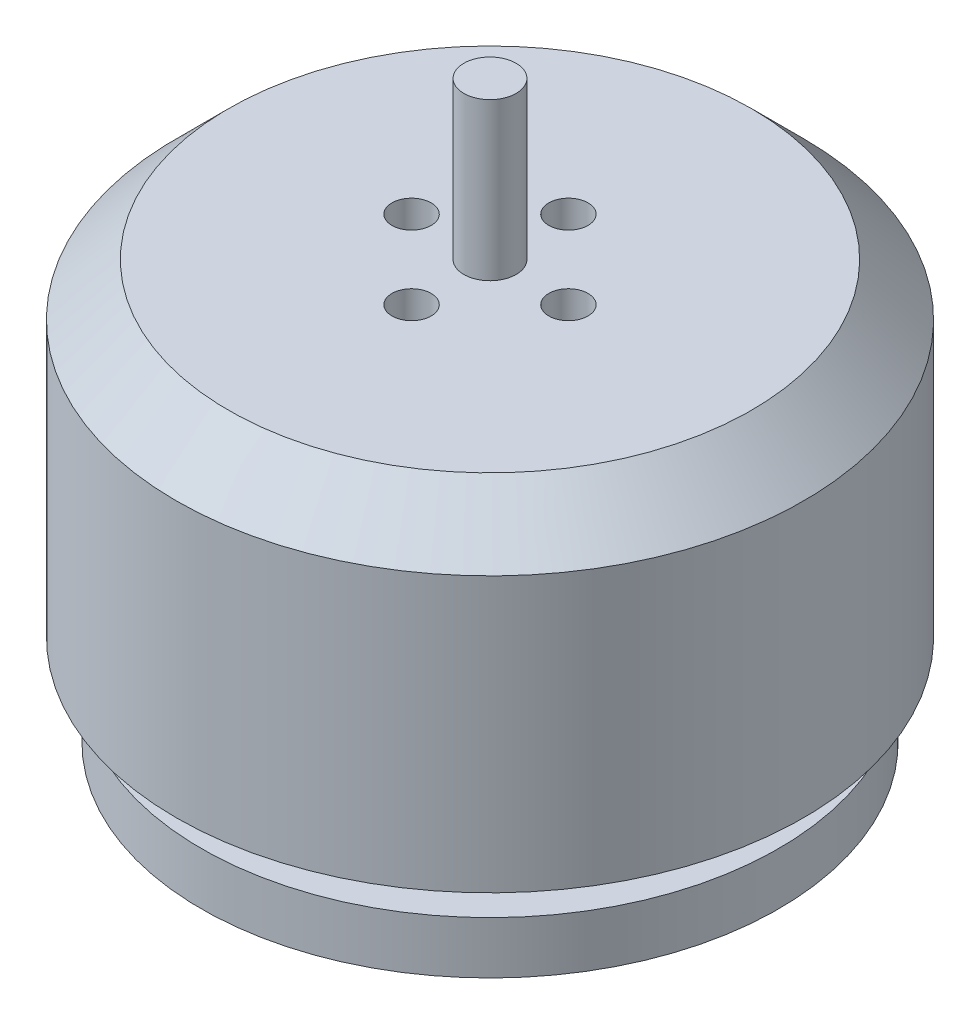
ISO-10303-21;
HEADER;
FILE_DESCRIPTION(('STEP AP214'),'2;1');
FILE_NAME('part.step','',(''),(''),'','','');
FILE_SCHEMA(('AUTOMOTIVE_DESIGN { 1 0 10303 214 1 1 1 1 }'));
ENDSEC;
DATA;
#1=APPLICATION_CONTEXT('core data for automotive mechanical design processes');
#2=APPLICATION_PROTOCOL_DEFINITION('international standard','automotive_design',2000,#1);
#3=PRODUCT_CONTEXT('',#1,'mechanical');
#4=PRODUCT('Part','Part','',(#3));
#5=PRODUCT_RELATED_PRODUCT_CATEGORY('part','',(#4));
#6=PRODUCT_DEFINITION_FORMATION('','',#4);
#7=PRODUCT_DEFINITION_CONTEXT('part definition',#1,'design');
#8=PRODUCT_DEFINITION('design','',#6,#7);
#9=PRODUCT_DEFINITION_SHAPE('','',#8);
#10=(LENGTH_UNIT() NAMED_UNIT(*) SI_UNIT(.MILLI.,.METRE.));
#11=(NAMED_UNIT(*) PLANE_ANGLE_UNIT() SI_UNIT($,.RADIAN.));
#12=(NAMED_UNIT(*) SI_UNIT($,.STERADIAN.) SOLID_ANGLE_UNIT());
#13=UNCERTAINTY_MEASURE_WITH_UNIT(LENGTH_MEASURE(1.E-05),#10,'distance_accuracy_value','');
#14=(GEOMETRIC_REPRESENTATION_CONTEXT(3) GLOBAL_UNCERTAINTY_ASSIGNED_CONTEXT((#13)) GLOBAL_UNIT_ASSIGNED_CONTEXT((#10,
#11,#12)) REPRESENTATION_CONTEXT('',''));
#15=CARTESIAN_POINT('',(0.,0.,0.));
#16=DIRECTION('',(0.,0.,1.));
#17=DIRECTION('',(1.,0.,0.));
#18=AXIS2_PLACEMENT_3D('',#15,#16,#17);
#19=CARTESIAN_POINT('',(0.,0.,0.));
#20=DIRECTION('',(0.,-1.,0.));
#21=DIRECTION('',(0.,0.,-1.));
#22=AXIS2_PLACEMENT_3D('',#19,#20,#21);
#23=PLANE('',#22);
#24=CARTESIAN_POINT('',(8.84,0.,-8.84));
#25=DIRECTION('',(0.,1.,0.));
#26=DIRECTION('',(0.,0.,1.));
#27=AXIS2_PLACEMENT_3D('',#24,#25,#26);
#28=CIRCLE('',#27,1.5);
#29=CARTESIAN_POINT('',(8.84,0.,-7.34));
#30=VERTEX_POINT('',#29);
#31=EDGE_CURVE('E75',#30,#30,#28,.T.);
#32=ORIENTED_EDGE('',*,*,#31,.T.);
#33=EDGE_LOOP('',(#32));
#34=FACE_BOUND('',#33,.T.);
#35=CARTESIAN_POINT('',(-8.84,0.,8.84));
#36=DIRECTION('',(0.,1.,0.));
#37=DIRECTION('',(0.,0.,1.));
#38=AXIS2_PLACEMENT_3D('',#35,#36,#37);
#39=CIRCLE('',#38,1.5);
#40=CARTESIAN_POINT('',(-8.84,0.,10.34));
#41=VERTEX_POINT('',#40);
#42=EDGE_CURVE('E81',#41,#41,#39,.T.);
#43=ORIENTED_EDGE('',*,*,#42,.T.);
#44=EDGE_LOOP('',(#43));
#45=FACE_BOUND('',#44,.T.);
#46=CARTESIAN_POINT('',(-8.84,0.,-8.84));
#47=DIRECTION('',(0.,1.,0.));
#48=DIRECTION('',(0.,0.,1.));
#49=AXIS2_PLACEMENT_3D('',#46,#47,#48);
#50=CIRCLE('',#49,1.5);
#51=CARTESIAN_POINT('',(-8.84,0.,-7.34));
#52=VERTEX_POINT('',#51);
#53=EDGE_CURVE('E82',#52,#52,#50,.T.);
#54=ORIENTED_EDGE('',*,*,#53,.T.);
#55=EDGE_LOOP('',(#54));
#56=FACE_BOUND('',#55,.T.);
#57=CARTESIAN_POINT('',(8.84,0.,8.84));
#58=DIRECTION('',(0.,1.,0.));
#59=DIRECTION('',(0.,0.,1.));
#60=AXIS2_PLACEMENT_3D('',#57,#58,#59);
#61=CIRCLE('',#60,1.5);
#62=CARTESIAN_POINT('',(8.84,0.,10.34));
#63=VERTEX_POINT('',#62);
#64=EDGE_CURVE('E72',#63,#63,#61,.T.);
#65=ORIENTED_EDGE('',*,*,#64,.T.);
#66=EDGE_LOOP('',(#65));
#67=FACE_BOUND('',#66,.T.);
#68=CARTESIAN_POINT('',(0.,0.,0.));
#69=DIRECTION('',(0.,-1.,0.));
#70=DIRECTION('',(0.,0.,-1.));
#71=AXIS2_PLACEMENT_3D('',#68,#69,#70);
#72=CIRCLE('',#71,22.08);
#73=CARTESIAN_POINT('',(0.,0.,-22.08));
#74=VERTEX_POINT('',#73);
#75=EDGE_CURVE('E10',#74,#74,#72,.T.);
#76=ORIENTED_EDGE('',*,*,#75,.T.);
#77=EDGE_LOOP('',(#76));
#78=FACE_BOUND('',#77,.T.);
#79=ADVANCED_FACE('F37',(#34,#45,#56,#67,#78),#23,.T.);
#80=CARTESIAN_POINT('',(0.,-10.,0.));
#81=DIRECTION('',(0.,-1.,0.));
#82=DIRECTION('',(0.,0.,-1.));
#83=AXIS2_PLACEMENT_3D('',#80,#81,#82);
#84=CYLINDRICAL_SURFACE('',#83,22.08);
#85=CARTESIAN_POINT('',(0.,4.,0.));
#86=DIRECTION('',(0.,-1.,0.));
#87=DIRECTION('',(0.,0.,-1.));
#88=AXIS2_PLACEMENT_3D('',#85,#86,#87);
#89=CIRCLE('',#88,22.08);
#90=CARTESIAN_POINT('',(0.,4.,-22.08));
#91=VERTEX_POINT('',#90);
#92=EDGE_CURVE('E43',#91,#91,#89,.T.);
#93=ORIENTED_EDGE('',*,*,#92,.T.);
#94=EDGE_LOOP('',(#93));
#95=FACE_BOUND('',#94,.T.);
#96=ORIENTED_EDGE('',*,*,#75,.F.);
#97=EDGE_LOOP('',(#96));
#98=FACE_BOUND('',#97,.T.);
#99=ADVANCED_FACE('F171',(#95,#98),#84,.T.);
#100=CARTESIAN_POINT('',(22.08,4.,0.));
#101=DIRECTION('',(0.,1.,0.));
#102=DIRECTION('',(0.,0.,1.));
#103=AXIS2_PLACEMENT_3D('',#100,#101,#102);
#104=PLANE('',#103);
#105=CARTESIAN_POINT('',(0.,4.,0.));
#106=DIRECTION('',(0.,-1.,0.));
#107=DIRECTION('',(0.,0.,-1.));
#108=AXIS2_PLACEMENT_3D('',#105,#106,#107);
#109=CIRCLE('',#108,16.8);
#110=CARTESIAN_POINT('',(0.,4.,-16.8));
#111=VERTEX_POINT('',#110);
#112=EDGE_CURVE('E47',#111,#111,#109,.T.);
#113=ORIENTED_EDGE('',*,*,#112,.T.);
#114=EDGE_LOOP('',(#113));
#115=FACE_BOUND('',#114,.T.);
#116=ORIENTED_EDGE('',*,*,#92,.F.);
#117=EDGE_LOOP('',(#116));
#118=FACE_BOUND('',#117,.T.);
#119=ADVANCED_FACE('F165',(#115,#118),#104,.T.);
#120=CARTESIAN_POINT('',(0.,-10.,0.));
#121=DIRECTION('',(0.,-1.,0.));
#122=DIRECTION('',(0.,0.,-1.));
#123=AXIS2_PLACEMENT_3D('',#120,#121,#122);
#124=CYLINDRICAL_SURFACE('',#123,16.8);
#125=CARTESIAN_POINT('',(0.,7.,0.));
#126=DIRECTION('',(0.,-1.,0.));
#127=DIRECTION('',(0.,0.,-1.));
#128=AXIS2_PLACEMENT_3D('',#125,#126,#127);
#129=CIRCLE('',#128,16.8);
#130=CARTESIAN_POINT('',(0.,7.,-16.8));
#131=VERTEX_POINT('',#130);
#132=EDGE_CURVE('E51',#131,#131,#129,.T.);
#133=ORIENTED_EDGE('',*,*,#132,.T.);
#134=EDGE_LOOP('',(#133));
#135=FACE_BOUND('',#134,.T.);
#136=ORIENTED_EDGE('',*,*,#112,.F.);
#137=EDGE_LOOP('',(#136));
#138=FACE_BOUND('',#137,.T.);
#139=ADVANCED_FACE('F159',(#135,#138),#124,.T.);
#140=CARTESIAN_POINT('',(16.8,7.,0.));
#141=DIRECTION('',(0.,-1.,0.));
#142=DIRECTION('',(0.,0.,-1.));
#143=AXIS2_PLACEMENT_3D('',#140,#141,#142);
#144=PLANE('',#143);
#145=CARTESIAN_POINT('',(0.,7.,0.));
#146=DIRECTION('',(0.,-1.,0.));
#147=DIRECTION('',(0.,0.,-1.));
#148=AXIS2_PLACEMENT_3D('',#145,#146,#147);
#149=CIRCLE('',#148,24.);
#150=CARTESIAN_POINT('',(0.,7.,-24.));
#151=VERTEX_POINT('',#150);
#152=EDGE_CURVE('E56',#151,#151,#149,.T.);
#153=ORIENTED_EDGE('',*,*,#152,.T.);
#154=EDGE_LOOP('',(#153));
#155=FACE_BOUND('',#154,.T.);
#156=ORIENTED_EDGE('',*,*,#132,.F.);
#157=EDGE_LOOP('',(#156));
#158=FACE_BOUND('',#157,.T.);
#159=ADVANCED_FACE('F153',(#155,#158),#144,.T.);
#160=CARTESIAN_POINT('',(0.,-10.,0.));
#161=DIRECTION('',(0.,-1.,0.));
#162=DIRECTION('',(0.,0.,-1.));
#163=AXIS2_PLACEMENT_3D('',#160,#161,#162);
#164=CYLINDRICAL_SURFACE('',#163,24.);
#165=CARTESIAN_POINT('',(0.,28.,0.));
#166=DIRECTION('',(0.,-1.,0.));
#167=DIRECTION('',(0.,0.,-1.));
#168=AXIS2_PLACEMENT_3D('',#165,#166,#167);
#169=CIRCLE('',#168,24.);
#170=CARTESIAN_POINT('',(0.,28.,-24.));
#171=VERTEX_POINT('',#170);
#172=EDGE_CURVE('E59',#171,#171,#169,.T.);
#173=ORIENTED_EDGE('',*,*,#172,.T.);
#174=EDGE_LOOP('',(#173));
#175=FACE_BOUND('',#174,.T.);
#176=ORIENTED_EDGE('',*,*,#152,.F.);
#177=EDGE_LOOP('',(#176));
#178=FACE_BOUND('',#177,.T.);
#179=ADVANCED_FACE('F147',(#175,#178),#164,.T.);
#180=CARTESIAN_POINT('',(0.,28.,0.));
#181=DIRECTION('',(0.,-1.,0.));
#182=DIRECTION('',(0.,0.,-1.));
#183=AXIS2_PLACEMENT_3D('',#180,#181,#182);
#184=CONICAL_SURFACE('',#183,24.,0.785398163397448);
#185=CARTESIAN_POINT('',(0.,32.,0.));
#186=DIRECTION('',(0.,-1.,0.));
#187=DIRECTION('',(0.,0.,-1.));
#188=AXIS2_PLACEMENT_3D('',#185,#186,#187);
#189=CIRCLE('',#188,20.);
#190=CARTESIAN_POINT('',(0.,32.,-20.));
#191=VERTEX_POINT('',#190);
#192=EDGE_CURVE('E62',#191,#191,#189,.T.);
#193=ORIENTED_EDGE('',*,*,#192,.T.);
#194=EDGE_LOOP('',(#193));
#195=FACE_BOUND('',#194,.T.);
#196=ORIENTED_EDGE('',*,*,#172,.F.);
#197=EDGE_LOOP('',(#196));
#198=FACE_BOUND('',#197,.T.);
#199=ADVANCED_FACE('F133',(#195,#198),#184,.T.);
#200=CARTESIAN_POINT('',(20.,32.,0.));
#201=DIRECTION('',(0.,1.,0.));
#202=DIRECTION('',(0.,0.,1.));
#203=AXIS2_PLACEMENT_3D('',#200,#201,#202);
#204=PLANE('',#203);
#205=CARTESIAN_POINT('',(6.,32.,0.));
#206=DIRECTION('',(0.,1.,0.));
#207=DIRECTION('',(0.,0.,1.));
#208=AXIS2_PLACEMENT_3D('',#205,#206,#207);
#209=CIRCLE('',#208,1.5);
#210=CARTESIAN_POINT('',(6.,32.,1.5));
#211=VERTEX_POINT('',#210);
#212=EDGE_CURVE('E114',#211,#211,#209,.T.);
#213=ORIENTED_EDGE('',*,*,#212,.F.);
#214=EDGE_LOOP('',(#213));
#215=FACE_BOUND('',#214,.T.);
#216=CARTESIAN_POINT('',(-6.,32.,0.));
#217=DIRECTION('',(0.,1.,0.));
#218=DIRECTION('',(0.,0.,1.));
#219=AXIS2_PLACEMENT_3D('',#216,#217,#218);
#220=CIRCLE('',#219,1.5);
#221=CARTESIAN_POINT('',(-6.,32.,1.5));
#222=VERTEX_POINT('',#221);
#223=EDGE_CURVE('E111',#222,#222,#220,.T.);
#224=ORIENTED_EDGE('',*,*,#223,.F.);
#225=EDGE_LOOP('',(#224));
#226=FACE_BOUND('',#225,.T.);
#227=CARTESIAN_POINT('',(0.,32.,6.));
#228=DIRECTION('',(0.,1.,0.));
#229=DIRECTION('',(0.,0.,1.));
#230=AXIS2_PLACEMENT_3D('',#227,#228,#229);
#231=CIRCLE('',#230,1.5);
#232=CARTESIAN_POINT('',(0.,32.,7.5));
#233=VERTEX_POINT('',#232);
#234=EDGE_CURVE('E105',#233,#233,#231,.T.);
#235=ORIENTED_EDGE('',*,*,#234,.F.);
#236=EDGE_LOOP('',(#235));
#237=FACE_BOUND('',#236,.T.);
#238=CARTESIAN_POINT('',(0.,32.,-6.));
#239=DIRECTION('',(0.,1.,0.));
#240=DIRECTION('',(0.,0.,1.));
#241=AXIS2_PLACEMENT_3D('',#238,#239,#240);
#242=CIRCLE('',#241,1.5);
#243=CARTESIAN_POINT('',(0.,32.,-4.5));
#244=VERTEX_POINT('',#243);
#245=EDGE_CURVE('E99',#244,#244,#242,.T.);
#246=ORIENTED_EDGE('',*,*,#245,.F.);
#247=EDGE_LOOP('',(#246));
#248=FACE_BOUND('',#247,.T.);
#249=CARTESIAN_POINT('',(0.,32.,0.));
#250=DIRECTION('',(0.,-1.,0.));
#251=DIRECTION('',(0.,0.,-1.));
#252=AXIS2_PLACEMENT_3D('',#249,#250,#251);
#253=CIRCLE('',#252,2.);
#254=CARTESIAN_POINT('',(0.,32.,-2.));
#255=VERTEX_POINT('',#254);
#256=EDGE_CURVE('E65',#255,#255,#253,.T.);
#257=ORIENTED_EDGE('',*,*,#256,.T.);
#258=EDGE_LOOP('',(#257));
#259=FACE_BOUND('',#258,.T.);
#260=ORIENTED_EDGE('',*,*,#192,.F.);
#261=EDGE_LOOP('',(#260));
#262=FACE_BOUND('',#261,.T.);
#263=ADVANCED_FACE('F129',(#215,#226,#237,#248,#259,#262),#204,.T.);
#264=CARTESIAN_POINT('',(0.,-10.,0.));
#265=DIRECTION('',(0.,-1.,0.));
#266=DIRECTION('',(0.,0.,-1.));
#267=AXIS2_PLACEMENT_3D('',#264,#265,#266);
#268=CYLINDRICAL_SURFACE('',#267,2.);
#269=CARTESIAN_POINT('',(0.,44.,0.));
#270=DIRECTION('',(0.,-1.,0.));
#271=DIRECTION('',(0.,0.,-1.));
#272=AXIS2_PLACEMENT_3D('',#269,#270,#271);
#273=CIRCLE('',#272,2.);
#274=CARTESIAN_POINT('',(0.,44.,-2.));
#275=VERTEX_POINT('',#274);
#276=EDGE_CURVE('E68',#275,#275,#273,.T.);
#277=ORIENTED_EDGE('',*,*,#276,.T.);
#278=EDGE_LOOP('',(#277));
#279=FACE_BOUND('',#278,.T.);
#280=ORIENTED_EDGE('',*,*,#256,.F.);
#281=EDGE_LOOP('',(#280));
#282=FACE_BOUND('',#281,.T.);
#283=ADVANCED_FACE('F132',(#279,#282),#268,.T.);
#284=CARTESIAN_POINT('',(2.,44.,0.));
#285=DIRECTION('',(0.,1.,0.));
#286=DIRECTION('',(0.,0.,1.));
#287=AXIS2_PLACEMENT_3D('',#284,#285,#286);
#288=PLANE('',#287);
#289=ORIENTED_EDGE('',*,*,#276,.F.);
#290=EDGE_LOOP('',(#289));
#291=FACE_BOUND('',#290,.T.);
#292=ADVANCED_FACE('F192',(#291),#288,.T.);
#293=CARTESIAN_POINT('',(8.84,3.3,8.84));
#294=DIRECTION('',(0.,-1.,0.));
#295=DIRECTION('',(0.,0.,-1.));
#296=AXIS2_PLACEMENT_3D('',#293,#294,#295);
#297=CYLINDRICAL_SURFACE('',#296,1.5);
#298=CARTESIAN_POINT('',(8.84,3.3,8.84));
#299=DIRECTION('',(0.,1.,0.));
#300=DIRECTION('',(0.,0.,1.));
#301=AXIS2_PLACEMENT_3D('',#298,#299,#300);
#302=CIRCLE('',#301,1.5);
#303=CARTESIAN_POINT('',(8.84,3.3,10.34));
#304=VERTEX_POINT('',#303);
#305=EDGE_CURVE('E71',#304,#304,#302,.T.);
#306=ORIENTED_EDGE('',*,*,#305,.T.);
#307=EDGE_LOOP('',(#306));
#308=FACE_BOUND('',#307,.T.);
#309=ORIENTED_EDGE('',*,*,#64,.F.);
#310=EDGE_LOOP('',(#309));
#311=FACE_BOUND('',#310,.T.);
#312=ADVANCED_FACE('F190',(#308,#311),#297,.F.);
#313=CARTESIAN_POINT('',(8.84,3.3,8.84));
#314=DIRECTION('',(0.,1.,0.));
#315=DIRECTION('',(0.,0.,1.));
#316=AXIS2_PLACEMENT_3D('',#313,#314,#315);
#317=PLANE('',#316);
#318=ORIENTED_EDGE('',*,*,#305,.F.);
#319=EDGE_LOOP('',(#318));
#320=FACE_BOUND('',#319,.T.);
#321=ADVANCED_FACE('F191',(#320),#317,.F.);
#322=CARTESIAN_POINT('',(-8.84,3.3,-8.84));
#323=DIRECTION('',(0.,-1.,0.));
#324=DIRECTION('',(0.,0.,-1.));
#325=AXIS2_PLACEMENT_3D('',#322,#323,#324);
#326=CYLINDRICAL_SURFACE('',#325,1.5);
#327=CARTESIAN_POINT('',(-8.84,3.3,-8.84));
#328=DIRECTION('',(0.,1.,0.));
#329=DIRECTION('',(0.,0.,1.));
#330=AXIS2_PLACEMENT_3D('',#327,#328,#329);
#331=CIRCLE('',#330,1.5);
#332=CARTESIAN_POINT('',(-8.84,3.3,-7.34));
#333=VERTEX_POINT('',#332);
#334=EDGE_CURVE('E90',#333,#333,#331,.T.);
#335=ORIENTED_EDGE('',*,*,#334,.T.);
#336=EDGE_LOOP('',(#335));
#337=FACE_BOUND('',#336,.T.);
#338=ORIENTED_EDGE('',*,*,#53,.F.);
#339=EDGE_LOOP('',(#338));
#340=FACE_BOUND('',#339,.T.);
#341=ADVANCED_FACE('F198',(#337,#340),#326,.F.);
#342=CARTESIAN_POINT('',(-8.84,3.3,-8.84));
#343=DIRECTION('',(0.,1.,0.));
#344=DIRECTION('',(0.,0.,1.));
#345=AXIS2_PLACEMENT_3D('',#342,#343,#344);
#346=PLANE('',#345);
#347=ORIENTED_EDGE('',*,*,#334,.F.);
#348=EDGE_LOOP('',(#347));
#349=FACE_BOUND('',#348,.T.);
#350=ADVANCED_FACE('F239',(#349),#346,.F.);
#351=CARTESIAN_POINT('',(-8.84,3.3,8.84));
#352=DIRECTION('',(0.,-1.,0.));
#353=DIRECTION('',(0.,0.,-1.));
#354=AXIS2_PLACEMENT_3D('',#351,#352,#353);
#355=CYLINDRICAL_SURFACE('',#354,1.5);
#356=CARTESIAN_POINT('',(-8.84,3.3,8.84));
#357=DIRECTION('',(0.,1.,0.));
#358=DIRECTION('',(0.,0.,1.));
#359=AXIS2_PLACEMENT_3D('',#356,#357,#358);
#360=CIRCLE('',#359,1.5);
#361=CARTESIAN_POINT('',(-8.84,3.3,10.34));
#362=VERTEX_POINT('',#361);
#363=EDGE_CURVE('E78',#362,#362,#360,.T.);
#364=ORIENTED_EDGE('',*,*,#363,.T.);
#365=EDGE_LOOP('',(#364));
#366=FACE_BOUND('',#365,.T.);
#367=ORIENTED_EDGE('',*,*,#42,.F.);
#368=EDGE_LOOP('',(#367));
#369=FACE_BOUND('',#368,.T.);
#370=ADVANCED_FACE('F249',(#366,#369),#355,.F.);
#371=CARTESIAN_POINT('',(-8.84,3.3,8.84));
#372=DIRECTION('',(0.,1.,0.));
#373=DIRECTION('',(0.,0.,1.));
#374=AXIS2_PLACEMENT_3D('',#371,#372,#373);
#375=PLANE('',#374);
#376=ORIENTED_EDGE('',*,*,#363,.F.);
#377=EDGE_LOOP('',(#376));
#378=FACE_BOUND('',#377,.T.);
#379=ADVANCED_FACE('F259',(#378),#375,.F.);
#380=CARTESIAN_POINT('',(8.84,3.3,-8.84));
#381=DIRECTION('',(0.,-1.,0.));
#382=DIRECTION('',(0.,0.,-1.));
#383=AXIS2_PLACEMENT_3D('',#380,#381,#382);
#384=CYLINDRICAL_SURFACE('',#383,1.5);
#385=CARTESIAN_POINT('',(8.84,3.3,-8.84));
#386=DIRECTION('',(0.,1.,0.));
#387=DIRECTION('',(0.,0.,1.));
#388=AXIS2_PLACEMENT_3D('',#385,#386,#387);
#389=CIRCLE('',#388,1.5);
#390=CARTESIAN_POINT('',(8.84,3.3,-7.34));
#391=VERTEX_POINT('',#390);
#392=EDGE_CURVE('E85',#391,#391,#389,.T.);
#393=ORIENTED_EDGE('',*,*,#392,.T.);
#394=EDGE_LOOP('',(#393));
#395=FACE_BOUND('',#394,.T.);
#396=ORIENTED_EDGE('',*,*,#31,.F.);
#397=EDGE_LOOP('',(#396));
#398=FACE_BOUND('',#397,.T.);
#399=ADVANCED_FACE('F269',(#395,#398),#384,.F.);
#400=CARTESIAN_POINT('',(8.84,3.3,-8.84));
#401=DIRECTION('',(0.,1.,0.));
#402=DIRECTION('',(0.,0.,1.));
#403=AXIS2_PLACEMENT_3D('',#400,#401,#402);
#404=PLANE('',#403);
#405=ORIENTED_EDGE('',*,*,#392,.F.);
#406=EDGE_LOOP('',(#405));
#407=FACE_BOUND('',#406,.T.);
#408=ADVANCED_FACE('F278',(#407),#404,.F.);
#409=CARTESIAN_POINT('',(0.,24.,-6.));
#410=DIRECTION('',(0.,1.,0.));
#411=DIRECTION('',(0.,0.,1.));
#412=AXIS2_PLACEMENT_3D('',#409,#410,#411);
#413=CYLINDRICAL_SURFACE('',#412,1.5);
#414=CARTESIAN_POINT('',(0.,24.,-6.));
#415=DIRECTION('',(0.,1.,0.));
#416=DIRECTION('',(0.,0.,1.));
#417=AXIS2_PLACEMENT_3D('',#414,#415,#416);
#418=CIRCLE('',#417,1.5);
#419=CARTESIAN_POINT('',(0.,24.,-4.5));
#420=VERTEX_POINT('',#419);
#421=EDGE_CURVE('E96',#420,#420,#418,.T.);
#422=ORIENTED_EDGE('',*,*,#421,.F.);
#423=EDGE_LOOP('',(#422));
#424=FACE_BOUND('',#423,.T.);
#425=ORIENTED_EDGE('',*,*,#245,.T.);
#426=EDGE_LOOP('',(#425));
#427=FACE_BOUND('',#426,.T.);
#428=ADVANCED_FACE('F288',(#424,#427),#413,.F.);
#429=CARTESIAN_POINT('',(0.,24.,-6.));
#430=DIRECTION('',(0.,1.,0.));
#431=DIRECTION('',(0.,0.,1.));
#432=AXIS2_PLACEMENT_3D('',#429,#430,#431);
#433=PLANE('',#432);
#434=ORIENTED_EDGE('',*,*,#421,.T.);
#435=EDGE_LOOP('',(#434));
#436=FACE_BOUND('',#435,.T.);
#437=ADVANCED_FACE('F298',(#436),#433,.T.);
#438=CARTESIAN_POINT('',(0.,24.,6.));
#439=DIRECTION('',(0.,1.,0.));
#440=DIRECTION('',(0.,0.,1.));
#441=AXIS2_PLACEMENT_3D('',#438,#439,#440);
#442=CYLINDRICAL_SURFACE('',#441,1.5);
#443=CARTESIAN_POINT('',(0.,24.,6.));
#444=DIRECTION('',(0.,1.,0.));
#445=DIRECTION('',(0.,0.,1.));
#446=AXIS2_PLACEMENT_3D('',#443,#444,#445);
#447=CIRCLE('',#446,1.5);
#448=CARTESIAN_POINT('',(0.,24.,7.5));
#449=VERTEX_POINT('',#448);
#450=EDGE_CURVE('E102',#449,#449,#447,.T.);
#451=ORIENTED_EDGE('',*,*,#450,.F.);
#452=EDGE_LOOP('',(#451));
#453=FACE_BOUND('',#452,.T.);
#454=ORIENTED_EDGE('',*,*,#234,.T.);
#455=EDGE_LOOP('',(#454));
#456=FACE_BOUND('',#455,.T.);
#457=ADVANCED_FACE('F308',(#453,#456),#442,.F.);
#458=CARTESIAN_POINT('',(0.,24.,6.));
#459=DIRECTION('',(0.,1.,0.));
#460=DIRECTION('',(0.,0.,1.));
#461=AXIS2_PLACEMENT_3D('',#458,#459,#460);
#462=PLANE('',#461);
#463=ORIENTED_EDGE('',*,*,#450,.T.);
#464=EDGE_LOOP('',(#463));
#465=FACE_BOUND('',#464,.T.);
#466=ADVANCED_FACE('F318',(#465),#462,.T.);
#467=CARTESIAN_POINT('',(-6.,24.,0.));
#468=DIRECTION('',(0.,1.,0.));
#469=DIRECTION('',(0.,0.,1.));
#470=AXIS2_PLACEMENT_3D('',#467,#468,#469);
#471=CYLINDRICAL_SURFACE('',#470,1.5);
#472=CARTESIAN_POINT('',(-6.,24.,0.));
#473=DIRECTION('',(0.,1.,0.));
#474=DIRECTION('',(0.,0.,1.));
#475=AXIS2_PLACEMENT_3D('',#472,#473,#474);
#476=CIRCLE('',#475,1.5);
#477=CARTESIAN_POINT('',(-6.,24.,1.5));
#478=VERTEX_POINT('',#477);
#479=EDGE_CURVE('E108',#478,#478,#476,.T.);
#480=ORIENTED_EDGE('',*,*,#479,.F.);
#481=EDGE_LOOP('',(#480));
#482=FACE_BOUND('',#481,.T.);
#483=ORIENTED_EDGE('',*,*,#223,.T.);
#484=EDGE_LOOP('',(#483));
#485=FACE_BOUND('',#484,.T.);
#486=ADVANCED_FACE('F328',(#482,#485),#471,.F.);
#487=CARTESIAN_POINT('',(-6.,24.,0.));
#488=DIRECTION('',(0.,1.,0.));
#489=DIRECTION('',(0.,0.,1.));
#490=AXIS2_PLACEMENT_3D('',#487,#488,#489);
#491=PLANE('',#490);
#492=ORIENTED_EDGE('',*,*,#479,.T.);
#493=EDGE_LOOP('',(#492));
#494=FACE_BOUND('',#493,.T.);
#495=ADVANCED_FACE('F125',(#494),#491,.T.);
#496=CARTESIAN_POINT('',(6.,24.,0.));
#497=DIRECTION('',(0.,1.,0.));
#498=DIRECTION('',(0.,0.,1.));
#499=AXIS2_PLACEMENT_3D('',#496,#497,#498);
#500=CYLINDRICAL_SURFACE('',#499,1.5);
#501=CARTESIAN_POINT('',(6.,24.,0.));
#502=DIRECTION('',(0.,1.,0.));
#503=DIRECTION('',(0.,0.,1.));
#504=AXIS2_PLACEMENT_3D('',#501,#502,#503);
#505=CIRCLE('',#504,1.5);
#506=CARTESIAN_POINT('',(6.,24.,1.5));
#507=VERTEX_POINT('',#506);
#508=EDGE_CURVE('E93',#507,#507,#505,.T.);
#509=ORIENTED_EDGE('',*,*,#508,.F.);
#510=EDGE_LOOP('',(#509));
#511=FACE_BOUND('',#510,.T.);
#512=ORIENTED_EDGE('',*,*,#212,.T.);
#513=EDGE_LOOP('',(#512));
#514=FACE_BOUND('',#513,.T.);
#515=ADVANCED_FACE('F122',(#511,#514),#500,.F.);
#516=CARTESIAN_POINT('',(6.,24.,0.));
#517=DIRECTION('',(0.,1.,0.));
#518=DIRECTION('',(0.,0.,1.));
#519=AXIS2_PLACEMENT_3D('',#516,#517,#518);
#520=PLANE('',#519);
#521=ORIENTED_EDGE('',*,*,#508,.T.);
#522=EDGE_LOOP('',(#521));
#523=FACE_BOUND('',#522,.T.);
#524=ADVANCED_FACE('F120',(#523),#520,.T.);
#525=CLOSED_SHELL('',(#79,#99,#119,#139,#159,#179,#199,#263,#283,#292,#312,#321,#341,#350,#370,
#379,#399,#408,#428,#437,#457,#466,#486,#495,#515,#524));
#526=MANIFOLD_SOLID_BREP('B2',#525);
#527=ADVANCED_BREP_SHAPE_REPRESENTATION('',(#18,#526),#14);
#528=SHAPE_DEFINITION_REPRESENTATION(#9,#527);
ENDSEC;
END-ISO-10303-21;
